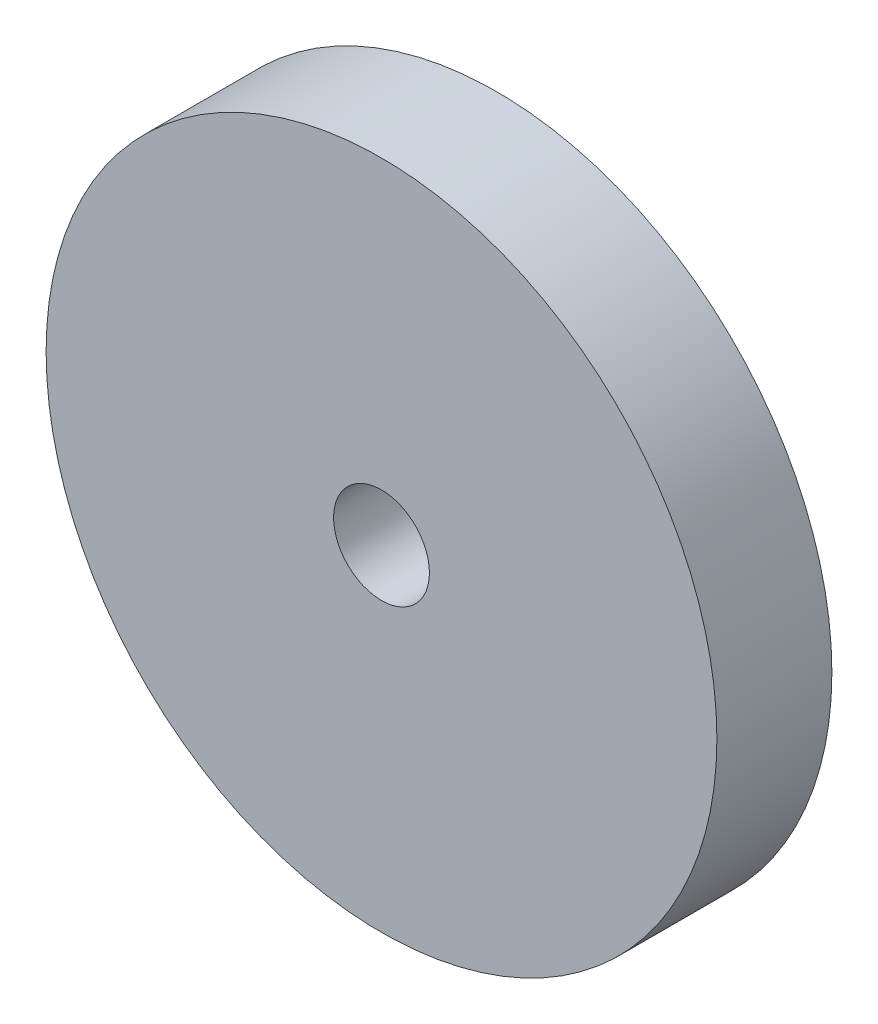
ISO-10303-21;
HEADER;
FILE_DESCRIPTION(('STEP AP214'),'2;1');
FILE_NAME('part.step','',(''),(''),'','','');
FILE_SCHEMA(('AUTOMOTIVE_DESIGN { 1 0 10303 214 1 1 1 1 }'));
ENDSEC;
DATA;
#1=APPLICATION_CONTEXT('core data for automotive mechanical design processes');
#2=APPLICATION_PROTOCOL_DEFINITION('international standard','automotive_design',2000,#1);
#3=PRODUCT_CONTEXT('',#1,'mechanical');
#4=PRODUCT('Part','Part','',(#3));
#5=PRODUCT_RELATED_PRODUCT_CATEGORY('part','',(#4));
#6=PRODUCT_DEFINITION_FORMATION('','',#4);
#7=PRODUCT_DEFINITION_CONTEXT('part definition',#1,'design');
#8=PRODUCT_DEFINITION('design','',#6,#7);
#9=PRODUCT_DEFINITION_SHAPE('','',#8);
#10=(LENGTH_UNIT() NAMED_UNIT(*) SI_UNIT(.MILLI.,.METRE.));
#11=(NAMED_UNIT(*) PLANE_ANGLE_UNIT() SI_UNIT($,.RADIAN.));
#12=(NAMED_UNIT(*) SI_UNIT($,.STERADIAN.) SOLID_ANGLE_UNIT());
#13=UNCERTAINTY_MEASURE_WITH_UNIT(LENGTH_MEASURE(1.E-05),#10,'distance_accuracy_value','');
#14=(GEOMETRIC_REPRESENTATION_CONTEXT(3) GLOBAL_UNCERTAINTY_ASSIGNED_CONTEXT((#13)) GLOBAL_UNIT_ASSIGNED_CONTEXT((#10,
#11,#12)) REPRESENTATION_CONTEXT('',''));
#15=CARTESIAN_POINT('',(0.,0.,0.));
#16=DIRECTION('',(0.,0.,1.));
#17=DIRECTION('',(1.,0.,0.));
#18=AXIS2_PLACEMENT_3D('',#15,#16,#17);
#19=CARTESIAN_POINT('',(0.,0.,3.));
#20=DIRECTION('',(0.,0.,1.));
#21=DIRECTION('',(1.,0.,0.));
#22=AXIS2_PLACEMENT_3D('',#19,#20,#21);
#23=PLANE('',#22);
#24=CARTESIAN_POINT('',(0.,0.,3.));
#25=DIRECTION('',(0.,0.,1.));
#26=DIRECTION('',(1.,0.,0.));
#27=AXIS2_PLACEMENT_3D('',#24,#25,#26);
#28=CIRCLE('',#27,8.75);
#29=CARTESIAN_POINT('',(8.75,0.,3.));
#30=VERTEX_POINT('',#29);
#31=EDGE_CURVE('E10',#30,#30,#28,.T.);
#32=ORIENTED_EDGE('',*,*,#31,.T.);
#33=EDGE_LOOP('',(#32));
#34=FACE_BOUND('',#33,.T.);
#35=CARTESIAN_POINT('',(0.,0.,3.));
#36=DIRECTION('',(0.,0.,1.));
#37=DIRECTION('',(1.,0.,0.));
#38=AXIS2_PLACEMENT_3D('',#35,#36,#37);
#39=CIRCLE('',#38,1.25);
#40=CARTESIAN_POINT('',(1.25,0.,3.));
#41=VERTEX_POINT('',#40);
#42=EDGE_CURVE('E41',#41,#41,#39,.T.);
#43=ORIENTED_EDGE('',*,*,#42,.F.);
#44=EDGE_LOOP('',(#43));
#45=FACE_BOUND('',#44,.T.);
#46=ADVANCED_FACE('F30',(#34,#45),#23,.T.);
#47=CARTESIAN_POINT('',(0.,0.,0.));
#48=DIRECTION('',(0.,0.,1.));
#49=DIRECTION('',(1.,0.,0.));
#50=AXIS2_PLACEMENT_3D('',#47,#48,#49);
#51=PLANE('',#50);
#52=CARTESIAN_POINT('',(0.,0.,0.));
#53=DIRECTION('',(0.,0.,1.));
#54=DIRECTION('',(1.,0.,0.));
#55=AXIS2_PLACEMENT_3D('',#52,#53,#54);
#56=CIRCLE('',#55,8.75);
#57=CARTESIAN_POINT('',(8.75,0.,0.));
#58=VERTEX_POINT('',#57);
#59=EDGE_CURVE('E34',#58,#58,#56,.T.);
#60=ORIENTED_EDGE('',*,*,#59,.F.);
#61=EDGE_LOOP('',(#60));
#62=FACE_BOUND('',#61,.T.);
#63=CARTESIAN_POINT('',(0.,0.,0.));
#64=DIRECTION('',(0.,0.,1.));
#65=DIRECTION('',(1.,0.,0.));
#66=AXIS2_PLACEMENT_3D('',#63,#64,#65);
#67=CIRCLE('',#66,1.25);
#68=CARTESIAN_POINT('',(1.25,0.,0.));
#69=VERTEX_POINT('',#68);
#70=EDGE_CURVE('E43',#69,#69,#67,.T.);
#71=ORIENTED_EDGE('',*,*,#70,.T.);
#72=EDGE_LOOP('',(#71));
#73=FACE_BOUND('',#72,.T.);
#74=ADVANCED_FACE('F53',(#62,#73),#51,.F.);
#75=CARTESIAN_POINT('',(0.,0.,3.));
#76=DIRECTION('',(0.,0.,-1.));
#77=DIRECTION('',(-1.,0.,0.));
#78=AXIS2_PLACEMENT_3D('',#75,#76,#77);
#79=CYLINDRICAL_SURFACE('',#78,8.75);
#80=ORIENTED_EDGE('',*,*,#31,.F.);
#81=EDGE_LOOP('',(#80));
#82=FACE_BOUND('',#81,.T.);
#83=ORIENTED_EDGE('',*,*,#59,.T.);
#84=EDGE_LOOP('',(#83));
#85=FACE_BOUND('',#84,.T.);
#86=ADVANCED_FACE('F32',(#82,#85),#79,.T.);
#87=CARTESIAN_POINT('',(0.,0.,3.));
#88=DIRECTION('',(0.,0.,-1.));
#89=DIRECTION('',(-1.,0.,0.));
#90=AXIS2_PLACEMENT_3D('',#87,#88,#89);
#91=CYLINDRICAL_SURFACE('',#90,1.25);
#92=ORIENTED_EDGE('',*,*,#42,.T.);
#93=EDGE_LOOP('',(#92));
#94=FACE_BOUND('',#93,.T.);
#95=ORIENTED_EDGE('',*,*,#70,.F.);
#96=EDGE_LOOP('',(#95));
#97=FACE_BOUND('',#96,.T.);
#98=ADVANCED_FACE('F49',(#94,#97),#91,.F.);
#99=CLOSED_SHELL('',(#46,#74,#86,#98));
#100=MANIFOLD_SOLID_BREP('B2',#99);
#101=ADVANCED_BREP_SHAPE_REPRESENTATION('',(#18,#100),#14);
#102=SHAPE_DEFINITION_REPRESENTATION(#9,#101);
ENDSEC;
END-ISO-10303-21;
